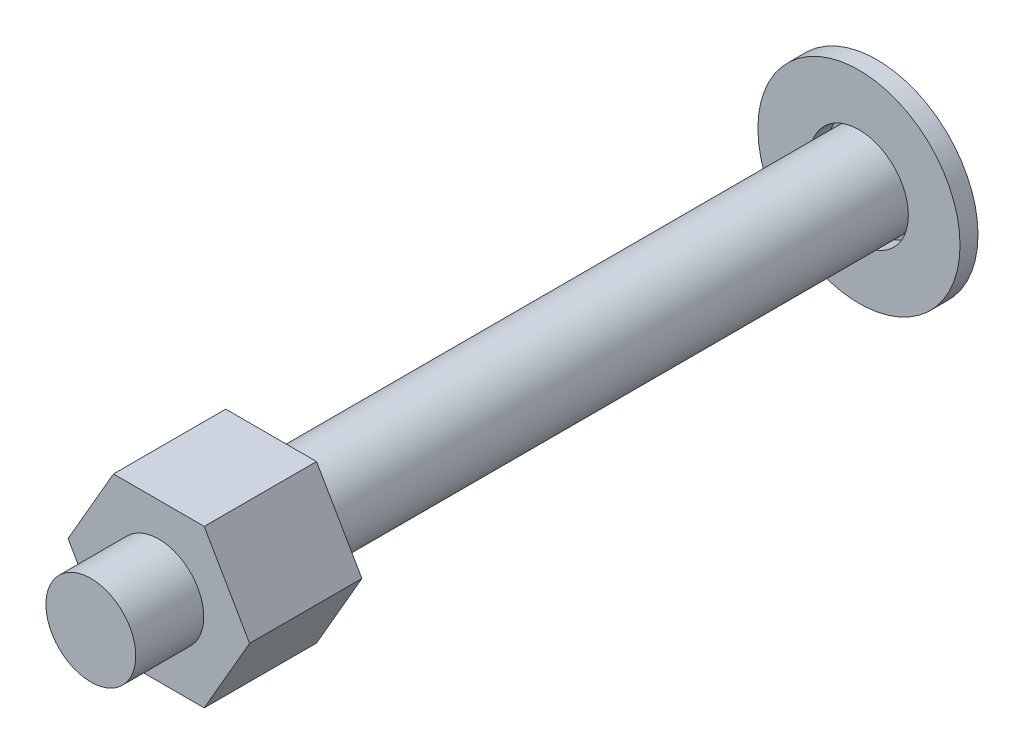
ISO-10303-21;
HEADER;
FILE_DESCRIPTION(('STEP AP214'),'2;1');
FILE_NAME('part.step','',(''),(''),'','','');
FILE_SCHEMA(('AUTOMOTIVE_DESIGN { 1 0 10303 214 1 1 1 1 }'));
ENDSEC;
DATA;
#1=APPLICATION_CONTEXT('core data for automotive mechanical design processes');
#2=APPLICATION_PROTOCOL_DEFINITION('international standard','automotive_design',2000,#1);
#3=PRODUCT_CONTEXT('',#1,'mechanical');
#4=PRODUCT('Part','Part','',(#3));
#5=PRODUCT_RELATED_PRODUCT_CATEGORY('part','',(#4));
#6=PRODUCT_DEFINITION_FORMATION('','',#4);
#7=PRODUCT_DEFINITION_CONTEXT('part definition',#1,'design');
#8=PRODUCT_DEFINITION('design','',#6,#7);
#9=PRODUCT_DEFINITION_SHAPE('','',#8);
#10=(LENGTH_UNIT() NAMED_UNIT(*) SI_UNIT(.MILLI.,.METRE.));
#11=(NAMED_UNIT(*) PLANE_ANGLE_UNIT() SI_UNIT($,.RADIAN.));
#12=(NAMED_UNIT(*) SI_UNIT($,.STERADIAN.) SOLID_ANGLE_UNIT());
#13=UNCERTAINTY_MEASURE_WITH_UNIT(LENGTH_MEASURE(1.E-05),#10,'distance_accuracy_value','');
#14=(GEOMETRIC_REPRESENTATION_CONTEXT(3) GLOBAL_UNCERTAINTY_ASSIGNED_CONTEXT((#13)) GLOBAL_UNIT_ASSIGNED_CONTEXT((#10,
#11,#12)) REPRESENTATION_CONTEXT('',''));
#15=CARTESIAN_POINT('',(0.,0.,0.));
#16=DIRECTION('',(0.,0.,1.));
#17=DIRECTION('',(1.,0.,0.));
#18=AXIS2_PLACEMENT_3D('',#15,#16,#17);
#19=CARTESIAN_POINT('',(-43.4,-59.9,61.2));
#20=DIRECTION('',(0.,0.,1.));
#21=DIRECTION('',(1.,0.,0.));
#22=AXIS2_PLACEMENT_3D('',#19,#20,#21);
#23=PLANE('',#22);
#24=CARTESIAN_POINT('',(-43.4,-59.9,61.2));
#25=DIRECTION('',(0.,0.,-1.));
#26=DIRECTION('',(1.,0.,0.));
#27=AXIS2_PLACEMENT_3D('',#24,#25,#26);
#28=CIRCLE('',#27,2.);
#29=CARTESIAN_POINT('',(-41.4,-59.9,61.2));
#30=VERTEX_POINT('',#29);
#31=EDGE_CURVE('E9',#30,#30,#28,.T.);
#32=ORIENTED_EDGE('',*,*,#31,.F.);
#33=EDGE_LOOP('',(#32));
#34=FACE_BOUND('',#33,.T.);
#35=ADVANCED_FACE('F14',(#34),#23,.T.);
#36=CARTESIAN_POINT('',(-43.4,-59.9,26.2));
#37=DIRECTION('',(0.,0.,1.));
#38=DIRECTION('',(1.,0.,0.));
#39=AXIS2_PLACEMENT_3D('',#36,#37,#38);
#40=CYLINDRICAL_SURFACE('',#39,2.);
#41=CARTESIAN_POINT('',(-43.4,-59.9,58.172415865385));
#42=DIRECTION('',(0.,0.,-1.));
#43=DIRECTION('',(1.,0.,0.));
#44=AXIS2_PLACEMENT_3D('',#41,#42,#43);
#45=CIRCLE('',#44,2.);
#46=CARTESIAN_POINT('',(-41.4,-59.9,58.172415865385));
#47=VERTEX_POINT('',#46);
#48=EDGE_CURVE('E255',#47,#47,#45,.T.);
#49=ORIENTED_EDGE('',*,*,#48,.F.);
#50=DIRECTION('',(0.,0.,1.));
#51=VECTOR('',#50,1.);
#52=CARTESIAN_POINT('',(-41.4,-59.9,26.2));
#53=LINE('',#52,#51);
#54=EDGE_CURVE('E25',#47,#30,#53,.T.);
#55=ORIENTED_EDGE('',*,*,#54,.T.);
#56=ORIENTED_EDGE('',*,*,#31,.T.);
#57=ORIENTED_EDGE('',*,*,#54,.F.);
#58=EDGE_LOOP('',(#49,#55,#56,#57));
#59=FACE_BOUND('',#58,.T.);
#60=ADVANCED_FACE('F387',(#59),#40,.T.);
#61=CARTESIAN_POINT('',(-43.4,-59.9,58.172415865385));
#62=DIRECTION('',(0.,0.,1.));
#63=DIRECTION('',(1.,0.,0.));
#64=AXIS2_PLACEMENT_3D('',#61,#62,#63);
#65=PLANE('',#64);
#66=ORIENTED_EDGE('',*,*,#48,.T.);
#67=EDGE_LOOP('',(#66));
#68=FACE_BOUND('',#67,.T.);
#69=DIRECTION('',(0.50000000000019,-0.866025403784329,0.));
#70=VECTOR('',#69,1.);
#71=CARTESIAN_POINT('',(-41.37927405783,-56.4,58.172415865385));
#72=LINE('',#71,#70);
#73=CARTESIAN_POINT('',(-41.37927405783,-56.4,58.172415865385));
#74=VERTEX_POINT('',#73);
#75=CARTESIAN_POINT('',(-39.35854811567,-59.9,58.172415865385));
#76=VERTEX_POINT('',#75);
#77=EDGE_CURVE('E248',#74,#76,#72,.T.);
#78=ORIENTED_EDGE('',*,*,#77,.F.);
#79=DIRECTION('',(1.,0.,0.));
#80=VECTOR('',#79,1.);
#81=CARTESIAN_POINT('',(-45.42072594216,-56.4,58.172415865385));
#82=LINE('',#81,#80);
#83=CARTESIAN_POINT('',(-45.42072594216,-56.4,58.172415865385));
#84=VERTEX_POINT('',#83);
#85=EDGE_CURVE('E126',#84,#74,#82,.T.);
#86=ORIENTED_EDGE('',*,*,#85,.F.);
#87=DIRECTION('',(0.50000000000019,0.866025403784329,0.));
#88=VECTOR('',#87,1.);
#89=CARTESIAN_POINT('',(-47.44145188432,-59.9,58.172415865385));
#90=LINE('',#89,#88);
#91=CARTESIAN_POINT('',(-47.44145188432,-59.9,58.172415865385));
#92=VERTEX_POINT('',#91);
#93=EDGE_CURVE('E252',#92,#84,#90,.T.);
#94=ORIENTED_EDGE('',*,*,#93,.F.);
#95=DIRECTION('',(-0.50000000000019,0.866025403784329,0.));
#96=VECTOR('',#95,1.);
#97=CARTESIAN_POINT('',(-45.42072594216,-63.4,58.172415865385));
#98=LINE('',#97,#96);
#99=CARTESIAN_POINT('',(-45.42072594216,-63.4,58.172415865385));
#100=VERTEX_POINT('',#99);
#101=EDGE_CURVE('E110',#100,#92,#98,.T.);
#102=ORIENTED_EDGE('',*,*,#101,.F.);
#103=DIRECTION('',(-1.,0.,0.));
#104=VECTOR('',#103,1.);
#105=CARTESIAN_POINT('',(-41.37927405783,-63.4,58.172415865385));
#106=LINE('',#105,#104);
#107=CARTESIAN_POINT('',(-41.37927405783,-63.4,58.172415865385));
#108=VERTEX_POINT('',#107);
#109=EDGE_CURVE('E291',#108,#100,#106,.T.);
#110=ORIENTED_EDGE('',*,*,#109,.F.);
#111=DIRECTION('',(-0.50000000000019,-0.866025403784329,0.));
#112=VECTOR('',#111,1.);
#113=CARTESIAN_POINT('',(-39.35854811567,-59.9,58.172415865385));
#114=LINE('',#113,#112);
#115=EDGE_CURVE('E207',#76,#108,#114,.T.);
#116=ORIENTED_EDGE('',*,*,#115,.F.);
#117=EDGE_LOOP('',(#78,#86,#94,#102,#110,#116));
#118=FACE_BOUND('',#117,.T.);
#119=ADVANCED_FACE('F393',(#68,#118),#65,.T.);
#120=CARTESIAN_POINT('',(-47.44145188432,-59.9,53.172415865385));
#121=DIRECTION('',(0.866025403784329,-0.50000000000019,0.));
#122=DIRECTION('',(0.,0.,-1.));
#123=AXIS2_PLACEMENT_3D('',#120,#121,#122);
#124=PLANE('',#123);
#125=DIRECTION('',(0.,0.,1.));
#126=VECTOR('',#125,1.);
#127=CARTESIAN_POINT('',(-47.44145188432,-59.9,53.172415865385));
#128=LINE('',#127,#126);
#129=CARTESIAN_POINT('',(-47.44145188432,-59.9,53.172415865385));
#130=VERTEX_POINT('',#129);
#131=EDGE_CURVE('E256',#130,#92,#128,.T.);
#132=ORIENTED_EDGE('',*,*,#131,.T.);
#133=ORIENTED_EDGE('',*,*,#93,.T.);
#134=DIRECTION('',(0.,0.,1.));
#135=VECTOR('',#134,1.);
#136=CARTESIAN_POINT('',(-45.42072594216,-56.4,53.172415865385));
#137=LINE('',#136,#135);
#138=CARTESIAN_POINT('',(-45.42072594216,-56.4,53.172415865385));
#139=VERTEX_POINT('',#138);
#140=EDGE_CURVE('E251',#139,#84,#137,.T.);
#141=ORIENTED_EDGE('',*,*,#140,.F.);
#142=DIRECTION('',(0.50000000000019,0.866025403784329,0.));
#143=VECTOR('',#142,1.);
#144=CARTESIAN_POINT('',(-47.44145188432,-59.9,53.172415865385));
#145=LINE('',#144,#143);
#146=EDGE_CURVE('E296',#130,#139,#145,.T.);
#147=ORIENTED_EDGE('',*,*,#146,.F.);
#148=EDGE_LOOP('',(#132,#133,#141,#147));
#149=FACE_BOUND('',#148,.T.);
#150=ADVANCED_FACE('F412',(#149),#124,.F.);
#151=CARTESIAN_POINT('',(-45.42072594216,-63.4,53.172415865385));
#152=DIRECTION('',(0.866025403784329,0.50000000000019,0.));
#153=DIRECTION('',(0.,0.,-1.));
#154=AXIS2_PLACEMENT_3D('',#151,#152,#153);
#155=PLANE('',#154);
#156=DIRECTION('',(0.,0.,1.));
#157=VECTOR('',#156,1.);
#158=CARTESIAN_POINT('',(-45.42072594216,-63.4,53.172415865385));
#159=LINE('',#158,#157);
#160=CARTESIAN_POINT('',(-45.42072594216,-63.4,53.172415865385));
#161=VERTEX_POINT('',#160);
#162=EDGE_CURVE('E288',#161,#100,#159,.T.);
#163=ORIENTED_EDGE('',*,*,#162,.T.);
#164=ORIENTED_EDGE('',*,*,#101,.T.);
#165=ORIENTED_EDGE('',*,*,#131,.F.);
#166=DIRECTION('',(-0.50000000000019,0.866025403784329,0.));
#167=VECTOR('',#166,1.);
#168=CARTESIAN_POINT('',(-45.42072594216,-63.4,53.172415865385));
#169=LINE('',#168,#167);
#170=EDGE_CURVE('E242',#161,#130,#169,.T.);
#171=ORIENTED_EDGE('',*,*,#170,.F.);
#172=EDGE_LOOP('',(#163,#164,#165,#171));
#173=FACE_BOUND('',#172,.T.);
#174=ADVANCED_FACE('F434',(#173),#155,.F.);
#175=CARTESIAN_POINT('',(-45.42072594216,-56.4,53.172415865385));
#176=DIRECTION('',(0.,-1.,0.));
#177=DIRECTION('',(0.,0.,-1.));
#178=AXIS2_PLACEMENT_3D('',#175,#176,#177);
#179=PLANE('',#178);
#180=ORIENTED_EDGE('',*,*,#140,.T.);
#181=ORIENTED_EDGE('',*,*,#85,.T.);
#182=DIRECTION('',(0.,0.,1.));
#183=VECTOR('',#182,1.);
#184=CARTESIAN_POINT('',(-41.37927405783,-56.4,53.172415865385));
#185=LINE('',#184,#183);
#186=CARTESIAN_POINT('',(-41.37927405783,-56.4,53.172415865385));
#187=VERTEX_POINT('',#186);
#188=EDGE_CURVE('E244',#187,#74,#185,.T.);
#189=ORIENTED_EDGE('',*,*,#188,.F.);
#190=DIRECTION('',(1.,0.,0.));
#191=VECTOR('',#190,1.);
#192=CARTESIAN_POINT('',(-45.42072594216,-56.4,53.172415865385));
#193=LINE('',#192,#191);
#194=EDGE_CURVE('E205',#139,#187,#193,.T.);
#195=ORIENTED_EDGE('',*,*,#194,.F.);
#196=EDGE_LOOP('',(#180,#181,#189,#195));
#197=FACE_BOUND('',#196,.T.);
#198=ADVANCED_FACE('F431',(#197),#179,.F.);
#199=CARTESIAN_POINT('',(-41.37927405783,-63.4,53.172415865385));
#200=DIRECTION('',(0.,1.,0.));
#201=DIRECTION('',(1.,0.,0.));
#202=AXIS2_PLACEMENT_3D('',#199,#200,#201);
#203=PLANE('',#202);
#204=DIRECTION('',(0.,0.,1.));
#205=VECTOR('',#204,1.);
#206=CARTESIAN_POINT('',(-41.37927405783,-63.4,53.172415865385));
#207=LINE('',#206,#205);
#208=CARTESIAN_POINT('',(-41.37927405783,-63.4,53.172415865385));
#209=VERTEX_POINT('',#208);
#210=EDGE_CURVE('E209',#209,#108,#207,.T.);
#211=ORIENTED_EDGE('',*,*,#210,.T.);
#212=ORIENTED_EDGE('',*,*,#109,.T.);
#213=ORIENTED_EDGE('',*,*,#162,.F.);
#214=DIRECTION('',(-1.,0.,0.));
#215=VECTOR('',#214,1.);
#216=CARTESIAN_POINT('',(-41.37927405783,-63.4,53.172415865385));
#217=LINE('',#216,#215);
#218=EDGE_CURVE('E238',#209,#161,#217,.T.);
#219=ORIENTED_EDGE('',*,*,#218,.F.);
#220=EDGE_LOOP('',(#211,#212,#213,#219));
#221=FACE_BOUND('',#220,.T.);
#222=ADVANCED_FACE('F427',(#221),#203,.F.);
#223=CARTESIAN_POINT('',(-41.37927405783,-56.4,53.172415865385));
#224=DIRECTION('',(-0.866025403784329,-0.50000000000019,0.));
#225=DIRECTION('',(-0.50000000000019,0.866025403784329,0.));
#226=AXIS2_PLACEMENT_3D('',#223,#224,#225);
#227=PLANE('',#226);
#228=ORIENTED_EDGE('',*,*,#188,.T.);
#229=ORIENTED_EDGE('',*,*,#77,.T.);
#230=DIRECTION('',(0.,0.,1.));
#231=VECTOR('',#230,1.);
#232=CARTESIAN_POINT('',(-39.35854811567,-59.9,53.172415865385));
#233=LINE('',#232,#231);
#234=CARTESIAN_POINT('',(-39.35854811567,-59.9,53.172415865385));
#235=VERTEX_POINT('',#234);
#236=EDGE_CURVE('E210',#235,#76,#233,.T.);
#237=ORIENTED_EDGE('',*,*,#236,.F.);
#238=DIRECTION('',(0.50000000000019,-0.866025403784329,0.));
#239=VECTOR('',#238,1.);
#240=CARTESIAN_POINT('',(-41.37927405783,-56.4,53.172415865385));
#241=LINE('',#240,#239);
#242=EDGE_CURVE('E231',#187,#235,#241,.T.);
#243=ORIENTED_EDGE('',*,*,#242,.F.);
#244=EDGE_LOOP('',(#228,#229,#237,#243));
#245=FACE_BOUND('',#244,.T.);
#246=ADVANCED_FACE('F423',(#245),#227,.F.);
#247=CARTESIAN_POINT('',(-39.35854811567,-59.9,53.172415865385));
#248=DIRECTION('',(-0.866025403784329,0.50000000000019,0.));
#249=DIRECTION('',(0.,0.,1.));
#250=AXIS2_PLACEMENT_3D('',#247,#248,#249);
#251=PLANE('',#250);
#252=ORIENTED_EDGE('',*,*,#236,.T.);
#253=ORIENTED_EDGE('',*,*,#115,.T.);
#254=ORIENTED_EDGE('',*,*,#210,.F.);
#255=DIRECTION('',(-0.50000000000019,-0.866025403784329,0.));
#256=VECTOR('',#255,1.);
#257=CARTESIAN_POINT('',(-39.35854811567,-59.9,53.172415865385));
#258=LINE('',#257,#256);
#259=EDGE_CURVE('E243',#235,#209,#258,.T.);
#260=ORIENTED_EDGE('',*,*,#259,.F.);
#261=EDGE_LOOP('',(#252,#253,#254,#260));
#262=FACE_BOUND('',#261,.T.);
#263=ADVANCED_FACE('F426',(#262),#251,.F.);
#264=CARTESIAN_POINT('',(-43.4,-59.9,53.172415865385));
#265=DIRECTION('',(0.,0.,1.));
#266=DIRECTION('',(1.,0.,0.));
#267=AXIS2_PLACEMENT_3D('',#264,#265,#266);
#268=PLANE('',#267);
#269=CARTESIAN_POINT('',(-43.4,-59.9,53.172415865385));
#270=DIRECTION('',(0.,0.,-1.));
#271=DIRECTION('',(1.,0.,0.));
#272=AXIS2_PLACEMENT_3D('',#269,#270,#271);
#273=CIRCLE('',#272,2.);
#274=CARTESIAN_POINT('',(-41.4,-59.9,53.172415865385));
#275=VERTEX_POINT('',#274);
#276=EDGE_CURVE('E294',#275,#275,#273,.T.);
#277=ORIENTED_EDGE('',*,*,#276,.F.);
#278=EDGE_LOOP('',(#277));
#279=FACE_BOUND('',#278,.T.);
#280=ORIENTED_EDGE('',*,*,#259,.T.);
#281=ORIENTED_EDGE('',*,*,#218,.T.);
#282=ORIENTED_EDGE('',*,*,#170,.T.);
#283=ORIENTED_EDGE('',*,*,#146,.T.);
#284=ORIENTED_EDGE('',*,*,#194,.T.);
#285=ORIENTED_EDGE('',*,*,#242,.T.);
#286=EDGE_LOOP('',(#280,#281,#282,#283,#284,#285));
#287=FACE_BOUND('',#286,.T.);
#288=ADVANCED_FACE('F417',(#279,#287),#268,.F.);
#289=CARTESIAN_POINT('',(-43.4,-59.9,26.2));
#290=DIRECTION('',(0.,0.,1.));
#291=DIRECTION('',(1.,0.,0.));
#292=AXIS2_PLACEMENT_3D('',#289,#290,#291);
#293=CYLINDRICAL_SURFACE('',#292,2.);
#294=DIRECTION('',(0.,0.,1.));
#295=VECTOR('',#294,1.);
#296=CARTESIAN_POINT('',(-41.4,-59.9,26.2));
#297=LINE('',#296,#295);
#298=CARTESIAN_POINT('',(-41.4,-59.9,26.2));
#299=VERTEX_POINT('',#298);
#300=EDGE_CURVE('E261',#299,#275,#297,.T.);
#301=ORIENTED_EDGE('',*,*,#300,.F.);
#302=CARTESIAN_POINT('',(-43.4,-59.9,26.2));
#303=DIRECTION('',(0.,0.,-1.));
#304=DIRECTION('',(1.,0.,0.));
#305=AXIS2_PLACEMENT_3D('',#302,#303,#304);
#306=CIRCLE('',#305,2.);
#307=EDGE_CURVE('E257',#299,#299,#306,.T.);
#308=ORIENTED_EDGE('',*,*,#307,.F.);
#309=ORIENTED_EDGE('',*,*,#300,.T.);
#310=ORIENTED_EDGE('',*,*,#276,.T.);
#311=EDGE_LOOP('',(#301,#308,#309,#310));
#312=FACE_BOUND('',#311,.T.);
#313=ADVANCED_FACE('F414',(#312),#293,.T.);
#314=CARTESIAN_POINT('',(-43.4,-59.9,26.2));
#315=DIRECTION('',(0.,0.,1.));
#316=DIRECTION('',(1.,0.,0.));
#317=AXIS2_PLACEMENT_3D('',#314,#315,#316);
#318=PLANE('',#317);
#319=ORIENTED_EDGE('',*,*,#307,.T.);
#320=EDGE_LOOP('',(#319));
#321=FACE_BOUND('',#320,.T.);
#322=CARTESIAN_POINT('',(-43.4,-59.9,26.2));
#323=DIRECTION('',(0.,0.,-1.));
#324=DIRECTION('',(1.,0.,0.));
#325=AXIS2_PLACEMENT_3D('',#322,#323,#324);
#326=CIRCLE('',#325,2.2);
#327=CARTESIAN_POINT('',(-41.2,-59.9,26.2));
#328=VERTEX_POINT('',#327);
#329=EDGE_CURVE('E229',#328,#328,#326,.T.);
#330=ORIENTED_EDGE('',*,*,#329,.F.);
#331=EDGE_LOOP('',(#330));
#332=FACE_BOUND('',#331,.T.);
#333=ADVANCED_FACE('F380',(#321,#332),#318,.T.);
#334=CARTESIAN_POINT('',(-43.4,-59.9,25.7));
#335=DIRECTION('',(0.,0.,1.));
#336=DIRECTION('',(1.,0.,0.));
#337=AXIS2_PLACEMENT_3D('',#334,#335,#336);
#338=CYLINDRICAL_SURFACE('',#337,2.2);
#339=CARTESIAN_POINT('',(-43.4,-59.9,27.));
#340=DIRECTION('',(0.,0.,-1.));
#341=DIRECTION('',(1.,0.,0.));
#342=AXIS2_PLACEMENT_3D('',#339,#340,#341);
#343=CIRCLE('',#342,2.2);
#344=CARTESIAN_POINT('',(-41.2,-59.9,27.));
#345=VERTEX_POINT('',#344);
#346=EDGE_CURVE('E230',#345,#345,#343,.T.);
#347=ORIENTED_EDGE('',*,*,#346,.F.);
#348=DIRECTION('',(0.,0.,1.));
#349=VECTOR('',#348,1.);
#350=CARTESIAN_POINT('',(-41.2,-59.9,25.7));
#351=LINE('',#350,#349);
#352=EDGE_CURVE('E226',#328,#345,#351,.T.);
#353=ORIENTED_EDGE('',*,*,#352,.F.);
#354=ORIENTED_EDGE('',*,*,#329,.T.);
#355=ORIENTED_EDGE('',*,*,#352,.T.);
#356=EDGE_LOOP('',(#347,#353,#354,#355));
#357=FACE_BOUND('',#356,.T.);
#358=ADVANCED_FACE('F372',(#357),#338,.F.);
#359=CARTESIAN_POINT('',(-43.4,-59.9,27.));
#360=DIRECTION('',(0.,0.,1.));
#361=DIRECTION('',(1.,0.,0.));
#362=AXIS2_PLACEMENT_3D('',#359,#360,#361);
#363=PLANE('',#362);
#364=ORIENTED_EDGE('',*,*,#346,.T.);
#365=EDGE_LOOP('',(#364));
#366=FACE_BOUND('',#365,.T.);
#367=CARTESIAN_POINT('',(-43.4,-59.9,27.));
#368=DIRECTION('',(0.,0.,-1.));
#369=DIRECTION('',(1.,0.,0.));
#370=AXIS2_PLACEMENT_3D('',#367,#368,#369);
#371=CIRCLE('',#370,4.5);
#372=CARTESIAN_POINT('',(-38.9,-59.9,27.));
#373=VERTEX_POINT('',#372);
#374=EDGE_CURVE('E225',#373,#373,#371,.T.);
#375=ORIENTED_EDGE('',*,*,#374,.F.);
#376=EDGE_LOOP('',(#375));
#377=FACE_BOUND('',#376,.T.);
#378=ADVANCED_FACE('F370',(#366,#377),#363,.T.);
#379=CARTESIAN_POINT('',(-43.4,-59.9,26.2));
#380=DIRECTION('',(0.,0.,1.));
#381=DIRECTION('',(1.,0.,0.));
#382=AXIS2_PLACEMENT_3D('',#379,#380,#381);
#383=CYLINDRICAL_SURFACE('',#382,4.5);
#384=DIRECTION('',(0.,0.,1.));
#385=VECTOR('',#384,1.);
#386=CARTESIAN_POINT('',(-38.9,-59.9,26.2));
#387=LINE('',#386,#385);
#388=CARTESIAN_POINT('',(-38.9,-59.9,26.2));
#389=VERTEX_POINT('',#388);
#390=EDGE_CURVE('E221',#389,#373,#387,.T.);
#391=ORIENTED_EDGE('',*,*,#390,.F.);
#392=CARTESIAN_POINT('',(-43.4,-59.9,26.2));
#393=DIRECTION('',(0.,0.,-1.));
#394=DIRECTION('',(1.,0.,0.));
#395=AXIS2_PLACEMENT_3D('',#392,#393,#394);
#396=CIRCLE('',#395,4.5);
#397=EDGE_CURVE('E215',#389,#389,#396,.T.);
#398=ORIENTED_EDGE('',*,*,#397,.F.);
#399=ORIENTED_EDGE('',*,*,#390,.T.);
#400=ORIENTED_EDGE('',*,*,#374,.T.);
#401=EDGE_LOOP('',(#391,#398,#399,#400));
#402=FACE_BOUND('',#401,.T.);
#403=ADVANCED_FACE('F16',(#402),#383,.T.);
#404=CARTESIAN_POINT('',(-43.4,-59.9,25.3));
#405=DIRECTION('',(0.,0.,1.));
#406=DIRECTION('',(1.,0.,0.));
#407=AXIS2_PLACEMENT_3D('',#404,#405,#406);
#408=PLANE('',#407);
#409=DIRECTION('',(-0.50000000000019,-0.866025403784329,0.));
#410=VECTOR('',#409,1.);
#411=CARTESIAN_POINT('',(-41.95662432702,-59.9,25.3));
#412=LINE('',#411,#410);
#413=CARTESIAN_POINT('',(-41.95662432702,-59.9,25.3));
#414=VERTEX_POINT('',#413);
#415=CARTESIAN_POINT('',(-42.67831216351,-61.15,25.3));
#416=VERTEX_POINT('',#415);
#417=EDGE_CURVE('E212',#414,#416,#412,.T.);
#418=ORIENTED_EDGE('',*,*,#417,.T.);
#419=DIRECTION('',(-1.,0.,0.));
#420=VECTOR('',#419,1.);
#421=CARTESIAN_POINT('',(-42.67831216351,-61.15,25.3));
#422=LINE('',#421,#420);
#423=CARTESIAN_POINT('',(-44.12168783648,-61.15,25.3));
#424=VERTEX_POINT('',#423);
#425=EDGE_CURVE('E176',#416,#424,#422,.T.);
#426=ORIENTED_EDGE('',*,*,#425,.T.);
#427=DIRECTION('',(-0.50000000000019,0.866025403784329,0.));
#428=VECTOR('',#427,1.);
#429=CARTESIAN_POINT('',(-44.12168783648,-61.15,25.3));
#430=LINE('',#429,#428);
#431=CARTESIAN_POINT('',(-44.84337567297,-59.9,25.3));
#432=VERTEX_POINT('',#431);
#433=EDGE_CURVE('E169',#424,#432,#430,.T.);
#434=ORIENTED_EDGE('',*,*,#433,.T.);
#435=DIRECTION('',(0.50000000000019,0.866025403784329,0.));
#436=VECTOR('',#435,1.);
#437=CARTESIAN_POINT('',(-44.84337567297,-59.9,25.3));
#438=LINE('',#437,#436);
#439=CARTESIAN_POINT('',(-44.12168783648,-58.65,25.3));
#440=VERTEX_POINT('',#439);
#441=EDGE_CURVE('E173',#432,#440,#438,.T.);
#442=ORIENTED_EDGE('',*,*,#441,.T.);
#443=DIRECTION('',(1.,0.,0.));
#444=VECTOR('',#443,1.);
#445=CARTESIAN_POINT('',(-44.12168783648,-58.65,25.3));
#446=LINE('',#445,#444);
#447=CARTESIAN_POINT('',(-42.67831216351,-58.65,25.3));
#448=VERTEX_POINT('',#447);
#449=EDGE_CURVE('E202',#440,#448,#446,.T.);
#450=ORIENTED_EDGE('',*,*,#449,.T.);
#451=DIRECTION('',(0.50000000000019,-0.866025403784329,0.));
#452=VECTOR('',#451,1.);
#453=CARTESIAN_POINT('',(-42.67831216351,-58.65,25.3));
#454=LINE('',#453,#452);
#455=EDGE_CURVE('E315',#448,#414,#454,.T.);
#456=ORIENTED_EDGE('',*,*,#455,.T.);
#457=EDGE_LOOP('',(#418,#426,#434,#442,#450,#456));
#458=FACE_BOUND('',#457,.T.);
#459=ADVANCED_FACE('F171',(#458),#408,.F.);
#460=CARTESIAN_POINT('',(-43.4,-59.9,26.2));
#461=DIRECTION('',(0.,0.,1.));
#462=DIRECTION('',(1.,0.,0.));
#463=AXIS2_PLACEMENT_3D('',#460,#461,#462);
#464=PLANE('',#463);
#465=CARTESIAN_POINT('',(-43.4,-59.9,26.2));
#466=DIRECTION('',(0.,0.,-1.));
#467=DIRECTION('',(1.,0.,0.));
#468=AXIS2_PLACEMENT_3D('',#465,#466,#467);
#469=CIRCLE('',#468,3.8);
#470=CARTESIAN_POINT('',(-39.6,-59.9,26.2));
#471=VERTEX_POINT('',#470);
#472=EDGE_CURVE('E268',#471,#471,#469,.T.);
#473=ORIENTED_EDGE('',*,*,#472,.F.);
#474=EDGE_LOOP('',(#473));
#475=FACE_BOUND('',#474,.T.);
#476=ORIENTED_EDGE('',*,*,#397,.T.);
#477=EDGE_LOOP('',(#476));
#478=FACE_BOUND('',#477,.T.);
#479=ADVANCED_FACE('F361',(#475,#478),#464,.F.);
#480=CARTESIAN_POINT('',(-41.95662432702,-59.9,23.9));
#481=DIRECTION('',(-0.866025403784329,0.50000000000019,0.));
#482=DIRECTION('',(0.,0.,1.));
#483=AXIS2_PLACEMENT_3D('',#480,#481,#482);
#484=PLANE('',#483);
#485=DIRECTION('',(0.,0.,1.));
#486=VECTOR('',#485,1.);
#487=CARTESIAN_POINT('',(-42.67831216351,-61.15,23.9));
#488=LINE('',#487,#486);
#489=CARTESIAN_POINT('',(-42.67831216351,-61.15,24.244548883697));
#490=VERTEX_POINT('',#489);
#491=EDGE_CURVE('E18',#490,#416,#488,.T.);
#492=ORIENTED_EDGE('',*,*,#491,.T.);
#493=ORIENTED_EDGE('',*,*,#417,.F.);
#494=DIRECTION('',(0.,0.,1.));
#495=VECTOR('',#494,1.);
#496=CARTESIAN_POINT('',(-41.95662432702,-59.9,23.9));
#497=LINE('',#496,#495);
#498=CARTESIAN_POINT('',(-41.95662432702,-59.9,24.244548883697));
#499=VERTEX_POINT('',#498);
#500=EDGE_CURVE('E272',#499,#414,#497,.T.);
#501=ORIENTED_EDGE('',*,*,#500,.F.);
#502=CARTESIAN_POINT('',(-42.31746824526,-60.525,28.381818181818));
#503=DIRECTION('',(0.866025403784329,-0.50000000000019,0.));
#504=DIRECTION('',(0.50000000000019,0.866025403784329,0.));
#505=AXIS2_PLACEMENT_3D('',#502,#503,#504);
#506=CIRCLE('',#505,4.199741727596);
#507=EDGE_CURVE('E306',#490,#499,#506,.T.);
#508=ORIENTED_EDGE('',*,*,#507,.F.);
#509=EDGE_LOOP('',(#492,#493,#501,#508));
#510=FACE_BOUND('',#509,.T.);
#511=ADVANCED_FACE('F364',(#510),#484,.T.);
#512=CARTESIAN_POINT('',(-42.67831216351,-61.15,23.9));
#513=DIRECTION('',(0.,1.,0.));
#514=DIRECTION('',(1.,0.,0.));
#515=AXIS2_PLACEMENT_3D('',#512,#513,#514);
#516=PLANE('',#515);
#517=DIRECTION('',(0.,0.,1.));
#518=VECTOR('',#517,1.);
#519=CARTESIAN_POINT('',(-44.12168783648,-61.15,23.9));
#520=LINE('',#519,#518);
#521=CARTESIAN_POINT('',(-44.12168783648,-61.15,24.244548883697));
#522=VERTEX_POINT('',#521);
#523=EDGE_CURVE('E180',#522,#424,#520,.T.);
#524=ORIENTED_EDGE('',*,*,#523,.T.);
#525=ORIENTED_EDGE('',*,*,#425,.F.);
#526=ORIENTED_EDGE('',*,*,#491,.F.);
#527=CARTESIAN_POINT('',(-43.4,-61.15,28.381818181818));
#528=DIRECTION('',(0.,-1.,0.));
#529=DIRECTION('',(1.,0.,0.));
#530=AXIS2_PLACEMENT_3D('',#527,#528,#529);
#531=CIRCLE('',#530,4.199741727596);
#532=EDGE_CURVE('E287',#522,#490,#531,.T.);
#533=ORIENTED_EDGE('',*,*,#532,.F.);
#534=EDGE_LOOP('',(#524,#525,#526,#533));
#535=FACE_BOUND('',#534,.T.);
#536=ADVANCED_FACE('F398',(#535),#516,.T.);
#537=CARTESIAN_POINT('',(-44.12168783648,-61.15,23.9));
#538=DIRECTION('',(0.866025403784329,0.50000000000019,0.));
#539=DIRECTION('',(0.,0.,-1.));
#540=AXIS2_PLACEMENT_3D('',#537,#538,#539);
#541=PLANE('',#540);
#542=DIRECTION('',(0.,0.,1.));
#543=VECTOR('',#542,1.);
#544=CARTESIAN_POINT('',(-44.84337567297,-59.9,23.9));
#545=LINE('',#544,#543);
#546=CARTESIAN_POINT('',(-44.84337567297,-59.9,24.244548883697));
#547=VERTEX_POINT('',#546);
#548=EDGE_CURVE('E181',#547,#432,#545,.T.);
#549=ORIENTED_EDGE('',*,*,#548,.T.);
#550=ORIENTED_EDGE('',*,*,#433,.F.);
#551=ORIENTED_EDGE('',*,*,#523,.F.);
#552=CARTESIAN_POINT('',(-44.48253175473,-60.525,28.381818181818));
#553=DIRECTION('',(-0.866025403784329,-0.50000000000019,0.));
#554=DIRECTION('',(0.50000000000019,-0.866025403784329,0.));
#555=AXIS2_PLACEMENT_3D('',#552,#553,#554);
#556=CIRCLE('',#555,4.199741727596);
#557=EDGE_CURVE('E186',#547,#522,#556,.T.);
#558=ORIENTED_EDGE('',*,*,#557,.F.);
#559=EDGE_LOOP('',(#549,#550,#551,#558));
#560=FACE_BOUND('',#559,.T.);
#561=ADVANCED_FACE('F184',(#560),#541,.T.);
#562=CARTESIAN_POINT('',(-44.84337567297,-59.9,23.9));
#563=DIRECTION('',(0.866025403784329,-0.50000000000019,0.));
#564=DIRECTION('',(0.,0.,-1.));
#565=AXIS2_PLACEMENT_3D('',#562,#563,#564);
#566=PLANE('',#565);
#567=DIRECTION('',(0.,0.,1.));
#568=VECTOR('',#567,1.);
#569=CARTESIAN_POINT('',(-44.12168783648,-58.65,23.9));
#570=LINE('',#569,#568);
#571=CARTESIAN_POINT('',(-44.12168783648,-58.65,24.244548883697));
#572=VERTEX_POINT('',#571);
#573=EDGE_CURVE('E194',#572,#440,#570,.T.);
#574=ORIENTED_EDGE('',*,*,#573,.T.);
#575=ORIENTED_EDGE('',*,*,#441,.F.);
#576=ORIENTED_EDGE('',*,*,#548,.F.);
#577=CARTESIAN_POINT('',(-44.48253175473,-59.275,28.381818181818));
#578=DIRECTION('',(-0.866025403784329,0.50000000000019,0.));
#579=DIRECTION('',(-0.50000000000019,-0.866025403784329,0.));
#580=AXIS2_PLACEMENT_3D('',#577,#578,#579);
#581=CIRCLE('',#580,4.199741727596);
#582=EDGE_CURVE('E280',#572,#547,#581,.T.);
#583=ORIENTED_EDGE('',*,*,#582,.F.);
#584=EDGE_LOOP('',(#574,#575,#576,#583));
#585=FACE_BOUND('',#584,.T.);
#586=ADVANCED_FACE('F192',(#585),#566,.T.);
#587=CARTESIAN_POINT('',(-44.12168783648,-58.65,23.9));
#588=DIRECTION('',(0.,-1.,0.));
#589=DIRECTION('',(0.,0.,-1.));
#590=AXIS2_PLACEMENT_3D('',#587,#588,#589);
#591=PLANE('',#590);
#592=DIRECTION('',(0.,0.,1.));
#593=VECTOR('',#592,1.);
#594=CARTESIAN_POINT('',(-42.67831216351,-58.65,23.9));
#595=LINE('',#594,#593);
#596=CARTESIAN_POINT('',(-42.67831216351,-58.65,24.244548883697));
#597=VERTEX_POINT('',#596);
#598=EDGE_CURVE('E276',#597,#448,#595,.T.);
#599=ORIENTED_EDGE('',*,*,#598,.T.);
#600=ORIENTED_EDGE('',*,*,#449,.F.);
#601=ORIENTED_EDGE('',*,*,#573,.F.);
#602=CARTESIAN_POINT('',(-43.4,-58.65,28.381818181818));
#603=DIRECTION('',(0.,1.,0.));
#604=DIRECTION('',(-1.,0.,0.));
#605=AXIS2_PLACEMENT_3D('',#602,#603,#604);
#606=CIRCLE('',#605,4.199741727596);
#607=EDGE_CURVE('E220',#597,#572,#606,.T.);
#608=ORIENTED_EDGE('',*,*,#607,.F.);
#609=EDGE_LOOP('',(#599,#600,#601,#608));
#610=FACE_BOUND('',#609,.T.);
#611=ADVANCED_FACE('F401',(#610),#591,.T.);
#612=CARTESIAN_POINT('',(-42.67831216351,-58.65,23.9));
#613=DIRECTION('',(-0.866025403784329,-0.50000000000019,0.));
#614=DIRECTION('',(-0.50000000000019,0.866025403784329,0.));
#615=AXIS2_PLACEMENT_3D('',#612,#613,#614);
#616=PLANE('',#615);
#617=ORIENTED_EDGE('',*,*,#500,.T.);
#618=ORIENTED_EDGE('',*,*,#455,.F.);
#619=ORIENTED_EDGE('',*,*,#598,.F.);
#620=CARTESIAN_POINT('',(-42.31746824526,-59.275,28.381818181818));
#621=DIRECTION('',(0.866025403784329,0.50000000000019,0.));
#622=DIRECTION('',(-0.50000000000019,0.866025403784329,0.));
#623=AXIS2_PLACEMENT_3D('',#620,#621,#622);
#624=CIRCLE('',#623,4.199741727596);
#625=EDGE_CURVE('E216',#499,#597,#624,.T.);
#626=ORIENTED_EDGE('',*,*,#625,.F.);
#627=EDGE_LOOP('',(#617,#618,#619,#626));
#628=FACE_BOUND('',#627,.T.);
#629=ADVANCED_FACE('F356',(#628),#616,.T.);
#630=CARTESIAN_POINT('',(-43.4,-59.9,28.381818181818));
#631=DIRECTION('',(0.,0.,1.));
#632=DIRECTION('',(1.,0.,0.));
#633=AXIS2_PLACEMENT_3D('',#630,#631,#632);
#634=SPHERICAL_SURFACE('',#633,4.381818181818);
#635=ORIENTED_EDGE('',*,*,#625,.T.);
#636=ORIENTED_EDGE('',*,*,#607,.T.);
#637=ORIENTED_EDGE('',*,*,#582,.T.);
#638=ORIENTED_EDGE('',*,*,#557,.T.);
#639=ORIENTED_EDGE('',*,*,#532,.T.);
#640=ORIENTED_EDGE('',*,*,#507,.T.);
#641=CARTESIAN_POINT('',(-43.4,-59.9,28.381818181818));
#642=DIRECTION('',(0.,-1.,0.));
#643=DIRECTION('',(1.,0.,0.));
#644=AXIS2_PLACEMENT_3D('',#641,#642,#643);
#645=CIRCLE('',#644,4.381818181818);
#646=EDGE_CURVE('E273',#499,#471,#645,.T.);
#647=ORIENTED_EDGE('',*,*,#646,.T.);
#648=ORIENTED_EDGE('',*,*,#472,.T.);
#649=ORIENTED_EDGE('',*,*,#646,.F.);
#650=EDGE_LOOP('',(#635,#636,#637,#638,#639,#640,#647,#648,#649));
#651=FACE_BOUND('',#650,.T.);
#652=ADVANCED_FACE('F351',(#651),#634,.T.);
#653=CLOSED_SHELL('',(#35,#60,#119,#150,#174,#198,#222,#246,#263,#288,#313,#333,#358,#378,#403,
#459,#479,#511,#536,#561,#586,#611,#629,#652));
#654=MANIFOLD_SOLID_BREP('B1',#653);
#655=ADVANCED_BREP_SHAPE_REPRESENTATION('',(#18,#654),#14);
#656=SHAPE_DEFINITION_REPRESENTATION(#9,#655);
ENDSEC;
END-ISO-10303-21;
